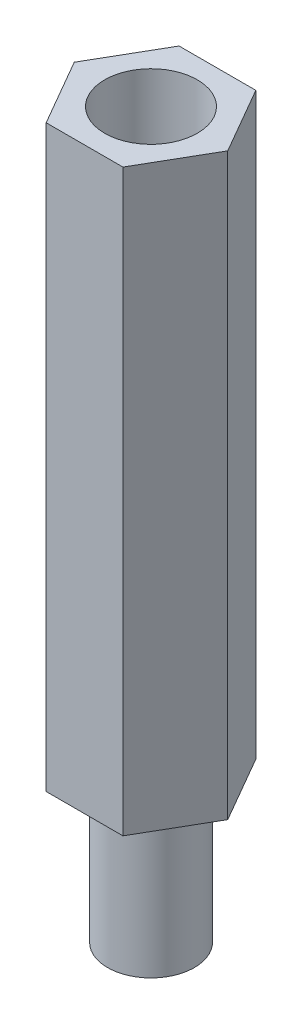
ISO-10303-21;
HEADER;
FILE_DESCRIPTION(('STEP AP214'),'2;1');
FILE_NAME('part.step','',(''),(''),'','','');
FILE_SCHEMA(('AUTOMOTIVE_DESIGN { 1 0 10303 214 1 1 1 1 }'));
ENDSEC;
DATA;
#1=APPLICATION_CONTEXT('core data for automotive mechanical design processes');
#2=APPLICATION_PROTOCOL_DEFINITION('international standard','automotive_design',2000,#1);
#3=PRODUCT_CONTEXT('',#1,'mechanical');
#4=PRODUCT('Part','Part','',(#3));
#5=PRODUCT_RELATED_PRODUCT_CATEGORY('part','',(#4));
#6=PRODUCT_DEFINITION_FORMATION('','',#4);
#7=PRODUCT_DEFINITION_CONTEXT('part definition',#1,'design');
#8=PRODUCT_DEFINITION('design','',#6,#7);
#9=PRODUCT_DEFINITION_SHAPE('','',#8);
#10=(LENGTH_UNIT() NAMED_UNIT(*) SI_UNIT(.MILLI.,.METRE.));
#11=(NAMED_UNIT(*) PLANE_ANGLE_UNIT() SI_UNIT($,.RADIAN.));
#12=(NAMED_UNIT(*) SI_UNIT($,.STERADIAN.) SOLID_ANGLE_UNIT());
#13=UNCERTAINTY_MEASURE_WITH_UNIT(LENGTH_MEASURE(1.E-05),#10,'distance_accuracy_value','');
#14=(GEOMETRIC_REPRESENTATION_CONTEXT(3) GLOBAL_UNCERTAINTY_ASSIGNED_CONTEXT((#13)) GLOBAL_UNIT_ASSIGNED_CONTEXT((#10,
#11,#12)) REPRESENTATION_CONTEXT('',''));
#15=CARTESIAN_POINT('',(0.,0.,0.));
#16=DIRECTION('',(0.,0.,1.));
#17=DIRECTION('',(1.,0.,0.));
#18=AXIS2_PLACEMENT_3D('',#15,#16,#17);
#19=CARTESIAN_POINT('',(1.32500000000003,20.,2.29496732002875));
#20=DIRECTION('',(-0.866025403784442,0.,-0.499999999999995));
#21=DIRECTION('',(-0.499999999999995,0.,0.866025403784442));
#22=AXIS2_PLACEMENT_3D('',#19,#20,#21);
#23=PLANE('',#22);
#24=DIRECTION('',(0.499999999999995,0.,-0.866025403784441));
#25=VECTOR('',#24,1.);
#26=CARTESIAN_POINT('',(1.32500000000003,0.,2.29496732002875));
#27=LINE('',#26,#25);
#28=CARTESIAN_POINT('',(1.32500000000003,0.,2.29496732002875));
#29=VERTEX_POINT('',#28);
#30=CARTESIAN_POINT('',(2.65,0.,0.));
#31=VERTEX_POINT('',#30);
#32=EDGE_CURVE('E130',#29,#31,#27,.T.);
#33=ORIENTED_EDGE('',*,*,#32,.T.);
#34=DIRECTION('',(0.,-1.,0.));
#35=VECTOR('',#34,1.);
#36=CARTESIAN_POINT('',(2.65,20.,0.));
#37=LINE('',#36,#35);
#38=CARTESIAN_POINT('',(2.65,20.,0.));
#39=VERTEX_POINT('',#38);
#40=EDGE_CURVE('E42',#39,#31,#37,.T.);
#41=ORIENTED_EDGE('',*,*,#40,.F.);
#42=DIRECTION('',(0.499999999999995,0.,-0.866025403784441));
#43=VECTOR('',#42,1.);
#44=CARTESIAN_POINT('',(1.32500000000003,20.,2.29496732002875));
#45=LINE('',#44,#43);
#46=CARTESIAN_POINT('',(1.32500000000003,20.,2.29496732002875));
#47=VERTEX_POINT('',#46);
#48=EDGE_CURVE('E147',#47,#39,#45,.T.);
#49=ORIENTED_EDGE('',*,*,#48,.F.);
#50=DIRECTION('',(0.,-1.,0.));
#51=VECTOR('',#50,1.);
#52=CARTESIAN_POINT('',(1.32500000000003,20.,2.29496732002875));
#53=LINE('',#52,#51);
#54=EDGE_CURVE('E126',#47,#29,#53,.T.);
#55=ORIENTED_EDGE('',*,*,#54,.T.);
#56=EDGE_LOOP('',(#33,#41,#49,#55));
#57=FACE_BOUND('',#56,.T.);
#58=ADVANCED_FACE('F39',(#57),#23,.F.);
#59=CARTESIAN_POINT('',(2.65,20.,0.));
#60=DIRECTION('',(-0.866025403784438,0.,0.500000000000001));
#61=DIRECTION('',(0.500000000000001,0.,0.866025403784438));
#62=AXIS2_PLACEMENT_3D('',#59,#60,#61);
#63=PLANE('',#62);
#64=DIRECTION('',(-0.500000000000001,0.,-0.866025403784438));
#65=VECTOR('',#64,1.);
#66=CARTESIAN_POINT('',(2.65,0.,0.));
#67=LINE('',#66,#65);
#68=CARTESIAN_POINT('',(1.32499999999999,0.,-2.29496732002877));
#69=VERTEX_POINT('',#68);
#70=EDGE_CURVE('E134',#31,#69,#67,.T.);
#71=ORIENTED_EDGE('',*,*,#70,.T.);
#72=DIRECTION('',(0.,-1.,0.));
#73=VECTOR('',#72,1.);
#74=CARTESIAN_POINT('',(1.32499999999999,20.,-2.29496732002877));
#75=LINE('',#74,#73);
#76=CARTESIAN_POINT('',(1.32499999999999,20.,-2.29496732002877));
#77=VERTEX_POINT('',#76);
#78=EDGE_CURVE('E153',#77,#69,#75,.T.);
#79=ORIENTED_EDGE('',*,*,#78,.F.);
#80=DIRECTION('',(-0.500000000000001,0.,-0.866025403784438));
#81=VECTOR('',#80,1.);
#82=CARTESIAN_POINT('',(2.65,20.,0.));
#83=LINE('',#82,#81);
#84=EDGE_CURVE('E95',#39,#77,#83,.T.);
#85=ORIENTED_EDGE('',*,*,#84,.F.);
#86=ORIENTED_EDGE('',*,*,#40,.T.);
#87=EDGE_LOOP('',(#71,#79,#85,#86));
#88=FACE_BOUND('',#87,.T.);
#89=ADVANCED_FACE('F160',(#88),#63,.F.);
#90=CARTESIAN_POINT('',(1.32499999999999,20.,-2.29496732002877));
#91=DIRECTION('',(0.,0.,1.));
#92=DIRECTION('',(1.,0.,0.));
#93=AXIS2_PLACEMENT_3D('',#90,#91,#92);
#94=PLANE('',#93);
#95=DIRECTION('',(-1.,0.,0.));
#96=VECTOR('',#95,1.);
#97=CARTESIAN_POINT('',(1.32499999999999,0.,-2.29496732002877));
#98=LINE('',#97,#96);
#99=CARTESIAN_POINT('',(-1.32500000000001,0.,-2.29496732002876));
#100=VERTEX_POINT('',#99);
#101=EDGE_CURVE('E138',#69,#100,#98,.T.);
#102=ORIENTED_EDGE('',*,*,#101,.T.);
#103=DIRECTION('',(0.,-1.,0.));
#104=VECTOR('',#103,1.);
#105=CARTESIAN_POINT('',(-1.32500000000001,20.,-2.29496732002876));
#106=LINE('',#105,#104);
#107=CARTESIAN_POINT('',(-1.32500000000001,20.,-2.29496732002876));
#108=VERTEX_POINT('',#107);
#109=EDGE_CURVE('E119',#108,#100,#106,.T.);
#110=ORIENTED_EDGE('',*,*,#109,.F.);
#111=DIRECTION('',(-1.,0.,0.));
#112=VECTOR('',#111,1.);
#113=CARTESIAN_POINT('',(1.32499999999999,20.,-2.29496732002877));
#114=LINE('',#113,#112);
#115=EDGE_CURVE('E108',#77,#108,#114,.T.);
#116=ORIENTED_EDGE('',*,*,#115,.F.);
#117=ORIENTED_EDGE('',*,*,#78,.T.);
#118=EDGE_LOOP('',(#102,#110,#116,#117));
#119=FACE_BOUND('',#118,.T.);
#120=ADVANCED_FACE('F166',(#119),#94,.F.);
#121=CARTESIAN_POINT('',(-1.32500000000001,20.,-2.29496732002876));
#122=DIRECTION('',(0.866025403784442,0.,0.499999999999995));
#123=DIRECTION('',(0.499999999999995,0.,-0.866025403784442));
#124=AXIS2_PLACEMENT_3D('',#121,#122,#123);
#125=PLANE('',#124);
#126=DIRECTION('',(-0.499999999999995,0.,0.866025403784442));
#127=VECTOR('',#126,1.);
#128=CARTESIAN_POINT('',(-1.32500000000001,0.,-2.29496732002876));
#129=LINE('',#128,#127);
#130=CARTESIAN_POINT('',(-2.65,0.,0.));
#131=VERTEX_POINT('',#130);
#132=EDGE_CURVE('E117',#100,#131,#129,.T.);
#133=ORIENTED_EDGE('',*,*,#132,.T.);
#134=DIRECTION('',(0.,-1.,0.));
#135=VECTOR('',#134,1.);
#136=CARTESIAN_POINT('',(-2.65,20.,0.));
#137=LINE('',#136,#135);
#138=CARTESIAN_POINT('',(-2.65,20.,0.));
#139=VERTEX_POINT('',#138);
#140=EDGE_CURVE('E114',#139,#131,#137,.T.);
#141=ORIENTED_EDGE('',*,*,#140,.F.);
#142=DIRECTION('',(-0.499999999999995,0.,0.866025403784442));
#143=VECTOR('',#142,1.);
#144=CARTESIAN_POINT('',(-1.32500000000001,20.,-2.29496732002876));
#145=LINE('',#144,#143);
#146=EDGE_CURVE('E102',#108,#139,#145,.T.);
#147=ORIENTED_EDGE('',*,*,#146,.F.);
#148=ORIENTED_EDGE('',*,*,#109,.T.);
#149=EDGE_LOOP('',(#133,#141,#147,#148));
#150=FACE_BOUND('',#149,.T.);
#151=ADVANCED_FACE('F115',(#150),#125,.F.);
#152=CARTESIAN_POINT('',(-2.65,20.,0.));
#153=DIRECTION('',(0.866025403784435,0.,-0.500000000000007));
#154=DIRECTION('',(-0.500000000000007,0.,-0.866025403784435));
#155=AXIS2_PLACEMENT_3D('',#152,#153,#154);
#156=PLANE('',#155);
#157=DIRECTION('',(0.500000000000007,0.,0.866025403784435));
#158=VECTOR('',#157,1.);
#159=CARTESIAN_POINT('',(-2.65,0.,0.));
#160=LINE('',#159,#158);
#161=CARTESIAN_POINT('',(-1.32499999999998,0.,2.29496732002877));
#162=VERTEX_POINT('',#161);
#163=EDGE_CURVE('E80',#131,#162,#160,.T.);
#164=ORIENTED_EDGE('',*,*,#163,.T.);
#165=DIRECTION('',(0.,-1.,0.));
#166=VECTOR('',#165,1.);
#167=CARTESIAN_POINT('',(-1.32499999999998,20.,2.29496732002877));
#168=LINE('',#167,#166);
#169=CARTESIAN_POINT('',(-1.32499999999998,20.,2.29496732002877));
#170=VERTEX_POINT('',#169);
#171=EDGE_CURVE('E120',#170,#162,#168,.T.);
#172=ORIENTED_EDGE('',*,*,#171,.F.);
#173=DIRECTION('',(0.500000000000007,0.,0.866025403784435));
#174=VECTOR('',#173,1.);
#175=CARTESIAN_POINT('',(-2.65,20.,0.));
#176=LINE('',#175,#174);
#177=EDGE_CURVE('E106',#139,#170,#176,.T.);
#178=ORIENTED_EDGE('',*,*,#177,.F.);
#179=ORIENTED_EDGE('',*,*,#140,.T.);
#180=EDGE_LOOP('',(#164,#172,#178,#179));
#181=FACE_BOUND('',#180,.T.);
#182=ADVANCED_FACE('F122',(#181),#156,.F.);
#183=CARTESIAN_POINT('',(-1.32499999999998,20.,2.29496732002877));
#184=DIRECTION('',(0.,0.,-1.));
#185=DIRECTION('',(-1.,0.,0.));
#186=AXIS2_PLACEMENT_3D('',#183,#184,#185);
#187=PLANE('',#186);
#188=DIRECTION('',(1.,0.,0.));
#189=VECTOR('',#188,1.);
#190=CARTESIAN_POINT('',(-1.32499999999998,0.,2.29496732002877));
#191=LINE('',#190,#189);
#192=EDGE_CURVE('E86',#162,#29,#191,.T.);
#193=ORIENTED_EDGE('',*,*,#192,.T.);
#194=ORIENTED_EDGE('',*,*,#54,.F.);
#195=DIRECTION('',(1.,0.,0.));
#196=VECTOR('',#195,1.);
#197=CARTESIAN_POINT('',(-1.32499999999998,20.,2.29496732002877));
#198=LINE('',#197,#196);
#199=EDGE_CURVE('E57',#170,#47,#198,.T.);
#200=ORIENTED_EDGE('',*,*,#199,.F.);
#201=ORIENTED_EDGE('',*,*,#171,.T.);
#202=EDGE_LOOP('',(#193,#194,#200,#201));
#203=FACE_BOUND('',#202,.T.);
#204=ADVANCED_FACE('F203',(#203),#187,.F.);
#205=CARTESIAN_POINT('',(0.,20.,0.));
#206=DIRECTION('',(0.,1.,0.));
#207=DIRECTION('',(0.,0.,1.));
#208=AXIS2_PLACEMENT_3D('',#205,#206,#207);
#209=PLANE('',#208);
#210=CARTESIAN_POINT('',(0.,20.,0.));
#211=DIRECTION('',(0.,1.,0.));
#212=DIRECTION('',(0.,0.,1.));
#213=AXIS2_PLACEMENT_3D('',#210,#211,#212);
#214=CIRCLE('',#213,1.6);
#215=CARTESIAN_POINT('',(0.,20.,1.6));
#216=VERTEX_POINT('',#215);
#217=EDGE_CURVE('E173',#216,#216,#214,.T.);
#218=ORIENTED_EDGE('',*,*,#217,.F.);
#219=EDGE_LOOP('',(#218));
#220=FACE_BOUND('',#219,.T.);
#221=ORIENTED_EDGE('',*,*,#48,.T.);
#222=ORIENTED_EDGE('',*,*,#84,.T.);
#223=ORIENTED_EDGE('',*,*,#115,.T.);
#224=ORIENTED_EDGE('',*,*,#146,.T.);
#225=ORIENTED_EDGE('',*,*,#177,.T.);
#226=ORIENTED_EDGE('',*,*,#199,.T.);
#227=EDGE_LOOP('',(#221,#222,#223,#224,#225,#226));
#228=FACE_BOUND('',#227,.T.);
#229=ADVANCED_FACE('F104',(#220,#228),#209,.T.);
#230=CARTESIAN_POINT('',(0.,0.,0.));
#231=DIRECTION('',(0.,1.,0.));
#232=DIRECTION('',(0.,0.,1.));
#233=AXIS2_PLACEMENT_3D('',#230,#231,#232);
#234=PLANE('',#233);
#235=CARTESIAN_POINT('',(0.,0.,0.));
#236=DIRECTION('',(0.,-1.,0.));
#237=DIRECTION('',(0.,0.,-1.));
#238=AXIS2_PLACEMENT_3D('',#235,#236,#237);
#239=CIRCLE('',#238,1.5);
#240=CARTESIAN_POINT('',(0.,0.,-1.5));
#241=VERTEX_POINT('',#240);
#242=EDGE_CURVE('E11',#241,#241,#239,.T.);
#243=ORIENTED_EDGE('',*,*,#242,.F.);
#244=EDGE_LOOP('',(#243));
#245=FACE_BOUND('',#244,.T.);
#246=ORIENTED_EDGE('',*,*,#32,.F.);
#247=ORIENTED_EDGE('',*,*,#192,.F.);
#248=ORIENTED_EDGE('',*,*,#163,.F.);
#249=ORIENTED_EDGE('',*,*,#132,.F.);
#250=ORIENTED_EDGE('',*,*,#101,.F.);
#251=ORIENTED_EDGE('',*,*,#70,.F.);
#252=EDGE_LOOP('',(#246,#247,#248,#249,#250,#251));
#253=FACE_BOUND('',#252,.T.);
#254=ADVANCED_FACE('F165',(#245,#253),#234,.F.);
#255=CARTESIAN_POINT('',(0.,15.,0.));
#256=DIRECTION('',(0.,1.,0.));
#257=DIRECTION('',(0.,0.,1.));
#258=AXIS2_PLACEMENT_3D('',#255,#256,#257);
#259=CYLINDRICAL_SURFACE('',#258,1.6);
#260=CARTESIAN_POINT('',(0.,15.,0.));
#261=DIRECTION('',(0.,1.,0.));
#262=DIRECTION('',(0.,0.,1.));
#263=AXIS2_PLACEMENT_3D('',#260,#261,#262);
#264=CIRCLE('',#263,1.6);
#265=CARTESIAN_POINT('',(0.,15.,1.6));
#266=VERTEX_POINT('',#265);
#267=EDGE_CURVE('E135',#266,#266,#264,.T.);
#268=ORIENTED_EDGE('',*,*,#267,.F.);
#269=EDGE_LOOP('',(#268));
#270=FACE_BOUND('',#269,.T.);
#271=ORIENTED_EDGE('',*,*,#217,.T.);
#272=EDGE_LOOP('',(#271));
#273=FACE_BOUND('',#272,.T.);
#274=ADVANCED_FACE('F195',(#270,#273),#259,.F.);
#275=CARTESIAN_POINT('',(0.,15.,0.));
#276=DIRECTION('',(0.,1.,0.));
#277=DIRECTION('',(0.,0.,1.));
#278=AXIS2_PLACEMENT_3D('',#275,#276,#277);
#279=PLANE('',#278);
#280=ORIENTED_EDGE('',*,*,#267,.T.);
#281=EDGE_LOOP('',(#280));
#282=FACE_BOUND('',#281,.T.);
#283=ADVANCED_FACE('F190',(#282),#279,.T.);
#284=CARTESIAN_POINT('',(0.,-5.,0.));
#285=DIRECTION('',(0.,1.,0.));
#286=DIRECTION('',(0.,0.,1.));
#287=AXIS2_PLACEMENT_3D('',#284,#285,#286);
#288=CYLINDRICAL_SURFACE('',#287,1.5);
#289=CARTESIAN_POINT('',(0.,-5.,0.));
#290=DIRECTION('',(0.,-1.,0.));
#291=DIRECTION('',(0.,0.,-1.));
#292=AXIS2_PLACEMENT_3D('',#289,#290,#291);
#293=CIRCLE('',#292,1.5);
#294=CARTESIAN_POINT('',(0.,-5.,-1.5));
#295=VERTEX_POINT('',#294);
#296=EDGE_CURVE('E177',#295,#295,#293,.T.);
#297=ORIENTED_EDGE('',*,*,#296,.F.);
#298=EDGE_LOOP('',(#297));
#299=FACE_BOUND('',#298,.T.);
#300=ORIENTED_EDGE('',*,*,#242,.T.);
#301=EDGE_LOOP('',(#300));
#302=FACE_BOUND('',#301,.T.);
#303=ADVANCED_FACE('F187',(#299,#302),#288,.T.);
#304=CARTESIAN_POINT('',(0.,-5.,0.));
#305=DIRECTION('',(0.,-1.,0.));
#306=DIRECTION('',(0.,0.,-1.));
#307=AXIS2_PLACEMENT_3D('',#304,#305,#306);
#308=PLANE('',#307);
#309=ORIENTED_EDGE('',*,*,#296,.T.);
#310=EDGE_LOOP('',(#309));
#311=FACE_BOUND('',#310,.T.);
#312=ADVANCED_FACE('F185',(#311),#308,.T.);
#313=CLOSED_SHELL('',(#58,#89,#120,#151,#182,#204,#229,#254,#274,#283,#303,#312));
#314=MANIFOLD_SOLID_BREP('B2',#313);
#315=ADVANCED_BREP_SHAPE_REPRESENTATION('',(#18,#314),#14);
#316=SHAPE_DEFINITION_REPRESENTATION(#9,#315);
ENDSEC;
END-ISO-10303-21;
